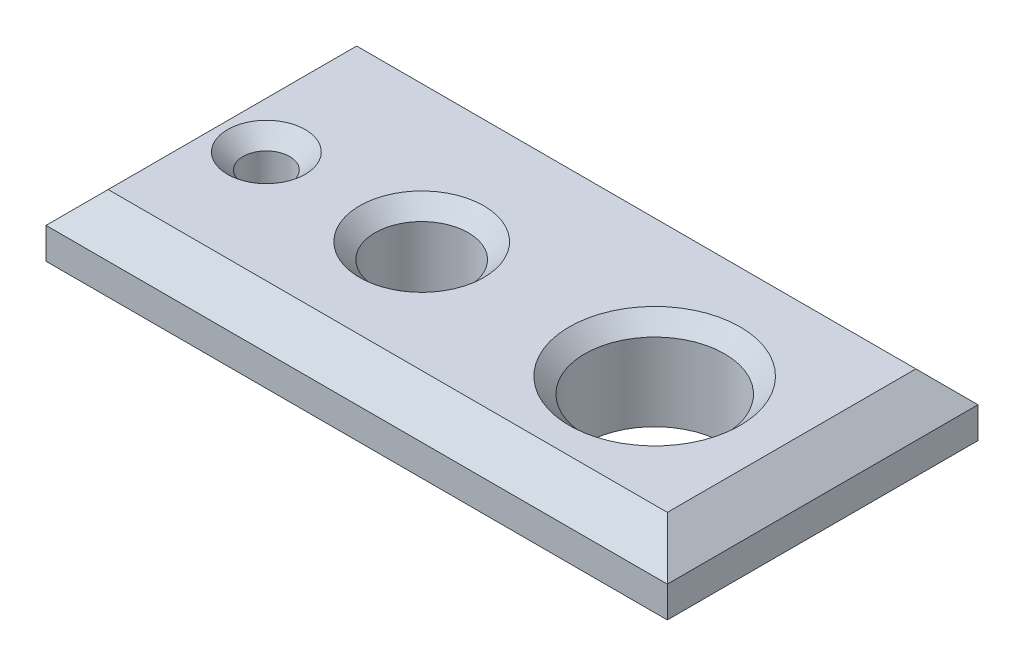
ISO-10303-21;
HEADER;
FILE_DESCRIPTION(('STEP AP214'),'2;1');
FILE_NAME('part.step','',(''),(''),'','','');
FILE_SCHEMA(('AUTOMOTIVE_DESIGN { 1 0 10303 214 1 1 1 1 }'));
ENDSEC;
DATA;
#1=APPLICATION_CONTEXT('core data for automotive mechanical design processes');
#2=APPLICATION_PROTOCOL_DEFINITION('international standard','automotive_design',2000,#1);
#3=PRODUCT_CONTEXT('',#1,'mechanical');
#4=PRODUCT('Part','Part','',(#3));
#5=PRODUCT_RELATED_PRODUCT_CATEGORY('part','',(#4));
#6=PRODUCT_DEFINITION_FORMATION('','',#4);
#7=PRODUCT_DEFINITION_CONTEXT('part definition',#1,'design');
#8=PRODUCT_DEFINITION('design','',#6,#7);
#9=PRODUCT_DEFINITION_SHAPE('','',#8);
#10=(LENGTH_UNIT() NAMED_UNIT(*) SI_UNIT(.MILLI.,.METRE.));
#11=(NAMED_UNIT(*) PLANE_ANGLE_UNIT() SI_UNIT($,.RADIAN.));
#12=(NAMED_UNIT(*) SI_UNIT($,.STERADIAN.) SOLID_ANGLE_UNIT());
#13=UNCERTAINTY_MEASURE_WITH_UNIT(LENGTH_MEASURE(1.E-05),#10,'distance_accuracy_value','');
#14=(GEOMETRIC_REPRESENTATION_CONTEXT(3) GLOBAL_UNCERTAINTY_ASSIGNED_CONTEXT((#13)) GLOBAL_UNIT_ASSIGNED_CONTEXT((#10,
#11,#12)) REPRESENTATION_CONTEXT('',''));
#15=CARTESIAN_POINT('',(0.,0.,0.));
#16=DIRECTION('',(0.,0.,1.));
#17=DIRECTION('',(1.,0.,0.));
#18=AXIS2_PLACEMENT_3D('',#15,#16,#17);
#19=CARTESIAN_POINT('',(0.,30.,0.));
#20=DIRECTION('',(0.,-1.,0.));
#21=DIRECTION('',(0.,0.,-1.));
#22=AXIS2_PLACEMENT_3D('',#19,#20,#21);
#23=PLANE('',#22);
#24=DIRECTION('',(0.,0.,-1.));
#25=VECTOR('',#24,1.);
#26=CARTESIAN_POINT('',(90.,30.,0.));
#27=LINE('',#26,#25);
#28=CARTESIAN_POINT('',(90.,30.,35.9308551425237));
#29=VERTEX_POINT('',#28);
#30=CARTESIAN_POINT('',(90.,30.,-44.0691448574762));
#31=VERTEX_POINT('',#30);
#32=EDGE_CURVE('E134',#29,#31,#27,.T.);
#33=ORIENTED_EDGE('',*,*,#32,.T.);
#34=DIRECTION('',(-1.,0.,0.));
#35=VECTOR('',#34,1.);
#36=CARTESIAN_POINT('',(0.,30.,-44.0691448574762));
#37=LINE('',#36,#35);
#38=CARTESIAN_POINT('',(-90.,30.,-44.0691448574762));
#39=VERTEX_POINT('',#38);
#40=EDGE_CURVE('E113',#31,#39,#37,.T.);
#41=ORIENTED_EDGE('',*,*,#40,.T.);
#42=DIRECTION('',(0.,0.,1.));
#43=VECTOR('',#42,1.);
#44=CARTESIAN_POINT('',(-90.,30.,0.));
#45=LINE('',#44,#43);
#46=CARTESIAN_POINT('',(-90.,30.,35.9308551425237));
#47=VERTEX_POINT('',#46);
#48=EDGE_CURVE('E122',#39,#47,#45,.T.);
#49=ORIENTED_EDGE('',*,*,#48,.T.);
#50=DIRECTION('',(1.,0.,0.));
#51=VECTOR('',#50,1.);
#52=CARTESIAN_POINT('',(0.,30.,35.9308551425237));
#53=LINE('',#52,#51);
#54=EDGE_CURVE('E129',#47,#29,#53,.T.);
#55=ORIENTED_EDGE('',*,*,#54,.T.);
#56=EDGE_LOOP('',(#33,#41,#49,#55));
#57=FACE_BOUND('',#56,.T.);
#58=CARTESIAN_POINT('',(-75.,30.,0.));
#59=DIRECTION('',(0.,-1.,0.));
#60=DIRECTION('',(0.,0.,-1.));
#61=AXIS2_PLACEMENT_3D('',#58,#59,#60);
#62=CIRCLE('',#61,12.5);
#63=CARTESIAN_POINT('',(-75.,30.,12.5));
#64=VERTEX_POINT('',#63);
#65=EDGE_CURVE('E258',#64,#64,#62,.T.);
#66=ORIENTED_EDGE('',*,*,#65,.T.);
#67=EDGE_LOOP('',(#66));
#68=FACE_BOUND('',#67,.T.);
#69=CARTESIAN_POINT('',(50.,30.,0.));
#70=DIRECTION('',(0.,-1.,0.));
#71=DIRECTION('',(0.,0.,-1.));
#72=AXIS2_PLACEMENT_3D('',#69,#70,#71);
#73=CIRCLE('',#72,27.5);
#74=CARTESIAN_POINT('',(50.,30.,-27.5));
#75=VERTEX_POINT('',#74);
#76=EDGE_CURVE('E254',#75,#75,#73,.T.);
#77=ORIENTED_EDGE('',*,*,#76,.T.);
#78=EDGE_LOOP('',(#77));
#79=FACE_BOUND('',#78,.T.);
#80=CARTESIAN_POINT('',(-25.,30.,0.));
#81=DIRECTION('',(0.,-1.,0.));
#82=DIRECTION('',(0.,0.,-1.));
#83=AXIS2_PLACEMENT_3D('',#80,#81,#82);
#84=CIRCLE('',#83,20.);
#85=CARTESIAN_POINT('',(-25.,30.,-20.));
#86=VERTEX_POINT('',#85);
#87=EDGE_CURVE('E250',#86,#86,#84,.T.);
#88=ORIENTED_EDGE('',*,*,#87,.T.);
#89=EDGE_LOOP('',(#88));
#90=FACE_BOUND('',#89,.T.);
#91=ADVANCED_FACE('F41',(#57,#68,#79,#90),#23,.F.);
#92=CARTESIAN_POINT('',(0.,0.,0.));
#93=DIRECTION('',(0.,-1.,0.));
#94=DIRECTION('',(0.,0.,-1.));
#95=AXIS2_PLACEMENT_3D('',#92,#93,#94);
#96=PLANE('',#95);
#97=DIRECTION('',(1.,0.,0.));
#98=VECTOR('',#97,1.);
#99=CARTESIAN_POINT('',(100.,0.,-44.0691448574762));
#100=LINE('',#99,#98);
#101=CARTESIAN_POINT('',(-90.,0.,-44.0691448574762));
#102=VERTEX_POINT('',#101);
#103=CARTESIAN_POINT('',(90.,0.,-44.0691448574762));
#104=VERTEX_POINT('',#103);
#105=EDGE_CURVE('E52',#102,#104,#100,.T.);
#106=ORIENTED_EDGE('',*,*,#105,.T.);
#107=DIRECTION('',(0.,0.,1.));
#108=VECTOR('',#107,1.);
#109=CARTESIAN_POINT('',(90.,0.,45.9308551425237));
#110=LINE('',#109,#108);
#111=CARTESIAN_POINT('',(90.,0.,35.9308551425237));
#112=VERTEX_POINT('',#111);
#113=EDGE_CURVE('E11',#104,#112,#110,.T.);
#114=ORIENTED_EDGE('',*,*,#113,.T.);
#115=DIRECTION('',(-1.,0.,0.));
#116=VECTOR('',#115,1.);
#117=CARTESIAN_POINT('',(-100.,0.,35.9308551425237));
#118=LINE('',#117,#116);
#119=CARTESIAN_POINT('',(-90.,0.,35.9308551425237));
#120=VERTEX_POINT('',#119);
#121=EDGE_CURVE('E166',#112,#120,#118,.T.);
#122=ORIENTED_EDGE('',*,*,#121,.T.);
#123=DIRECTION('',(0.,0.,-1.));
#124=VECTOR('',#123,1.);
#125=CARTESIAN_POINT('',(-90.,0.,-54.0691448574763));
#126=LINE('',#125,#124);
#127=EDGE_CURVE('E63',#120,#102,#126,.T.);
#128=ORIENTED_EDGE('',*,*,#127,.T.);
#129=EDGE_LOOP('',(#106,#114,#122,#128));
#130=FACE_BOUND('',#129,.T.);
#131=CARTESIAN_POINT('',(-25.,0.,0.));
#132=DIRECTION('',(0.,1.,0.));
#133=DIRECTION('',(0.,0.,1.));
#134=AXIS2_PLACEMENT_3D('',#131,#132,#133);
#135=CIRCLE('',#134,15.);
#136=CARTESIAN_POINT('',(-25.,0.,15.));
#137=VERTEX_POINT('',#136);
#138=EDGE_CURVE('E215',#137,#137,#135,.T.);
#139=ORIENTED_EDGE('',*,*,#138,.T.);
#140=EDGE_LOOP('',(#139));
#141=FACE_BOUND('',#140,.T.);
#142=CARTESIAN_POINT('',(-75.,0.,0.));
#143=DIRECTION('',(0.,1.,0.));
#144=DIRECTION('',(0.,0.,1.));
#145=AXIS2_PLACEMENT_3D('',#142,#143,#144);
#146=CIRCLE('',#145,7.50000000000001);
#147=CARTESIAN_POINT('',(-75.,0.,7.50000000000001));
#148=VERTEX_POINT('',#147);
#149=EDGE_CURVE('E219',#148,#148,#146,.T.);
#150=ORIENTED_EDGE('',*,*,#149,.T.);
#151=EDGE_LOOP('',(#150));
#152=FACE_BOUND('',#151,.T.);
#153=CARTESIAN_POINT('',(50.,0.,0.));
#154=DIRECTION('',(0.,1.,0.));
#155=DIRECTION('',(0.,0.,1.));
#156=AXIS2_PLACEMENT_3D('',#153,#154,#155);
#157=CIRCLE('',#156,22.5);
#158=CARTESIAN_POINT('',(50.,0.,22.5));
#159=VERTEX_POINT('',#158);
#160=EDGE_CURVE('E181',#159,#159,#157,.T.);
#161=ORIENTED_EDGE('',*,*,#160,.T.);
#162=EDGE_LOOP('',(#161));
#163=FACE_BOUND('',#162,.T.);
#164=ADVANCED_FACE('F207',(#130,#141,#152,#163),#96,.T.);
#165=CARTESIAN_POINT('',(-100.,30.,45.9308551425237));
#166=DIRECTION('',(1.,0.,0.));
#167=DIRECTION('',(0.,0.,-1.));
#168=AXIS2_PLACEMENT_3D('',#165,#166,#167);
#169=PLANE('',#168);
#170=DIRECTION('',(0.,-1.,0.));
#171=VECTOR('',#170,1.);
#172=CARTESIAN_POINT('',(-100.,30.,45.9308551425237));
#173=LINE('',#172,#171);
#174=CARTESIAN_POINT('',(-100.,19.9999999999999,45.9308551425237));
#175=VERTEX_POINT('',#174);
#176=CARTESIAN_POINT('',(-100.,10.,45.9308551425237));
#177=VERTEX_POINT('',#176);
#178=EDGE_CURVE('E242',#175,#177,#173,.T.);
#179=ORIENTED_EDGE('',*,*,#178,.F.);
#180=DIRECTION('',(0.,0.,-1.));
#181=VECTOR('',#180,1.);
#182=CARTESIAN_POINT('',(-100.,19.9999999999999,45.9308551425237));
#183=LINE('',#182,#181);
#184=CARTESIAN_POINT('',(-100.,19.9999999999999,-54.0691448574763));
#185=VERTEX_POINT('',#184);
#186=EDGE_CURVE('E163',#175,#185,#183,.T.);
#187=ORIENTED_EDGE('',*,*,#186,.T.);
#188=DIRECTION('',(0.,-1.,0.));
#189=VECTOR('',#188,1.);
#190=CARTESIAN_POINT('',(-100.,30.,-54.0691448574763));
#191=LINE('',#190,#189);
#192=CARTESIAN_POINT('',(-100.,10.,-54.0691448574763));
#193=VERTEX_POINT('',#192);
#194=EDGE_CURVE('E230',#185,#193,#191,.T.);
#195=ORIENTED_EDGE('',*,*,#194,.T.);
#196=DIRECTION('',(0.,0.,1.));
#197=VECTOR('',#196,1.);
#198=CARTESIAN_POINT('',(-100.,10.,45.9308551425237));
#199=LINE('',#198,#197);
#200=EDGE_CURVE('E160',#193,#177,#199,.T.);
#201=ORIENTED_EDGE('',*,*,#200,.T.);
#202=EDGE_LOOP('',(#179,#187,#195,#201));
#203=FACE_BOUND('',#202,.T.);
#204=ADVANCED_FACE('F210',(#203),#169,.F.);
#205=CARTESIAN_POINT('',(100.,30.,45.9308551425237));
#206=DIRECTION('',(0.,0.,-1.));
#207=DIRECTION('',(-1.,0.,0.));
#208=AXIS2_PLACEMENT_3D('',#205,#206,#207);
#209=PLANE('',#208);
#210=DIRECTION('',(0.,-1.,0.));
#211=VECTOR('',#210,1.);
#212=CARTESIAN_POINT('',(100.,30.,45.9308551425237));
#213=LINE('',#212,#211);
#214=CARTESIAN_POINT('',(100.,19.9999999999999,45.9308551425237));
#215=VERTEX_POINT('',#214);
#216=CARTESIAN_POINT('',(100.,10.,45.9308551425237));
#217=VERTEX_POINT('',#216);
#218=EDGE_CURVE('E238',#215,#217,#213,.T.);
#219=ORIENTED_EDGE('',*,*,#218,.F.);
#220=DIRECTION('',(-1.,0.,0.));
#221=VECTOR('',#220,1.);
#222=CARTESIAN_POINT('',(100.,19.9999999999999,45.9308551425237));
#223=LINE('',#222,#221);
#224=EDGE_CURVE('E157',#215,#175,#223,.T.);
#225=ORIENTED_EDGE('',*,*,#224,.T.);
#226=ORIENTED_EDGE('',*,*,#178,.T.);
#227=DIRECTION('',(1.,0.,0.));
#228=VECTOR('',#227,1.);
#229=CARTESIAN_POINT('',(100.,10.,45.9308551425237));
#230=LINE('',#229,#228);
#231=EDGE_CURVE('E154',#177,#217,#230,.T.);
#232=ORIENTED_EDGE('',*,*,#231,.T.);
#233=EDGE_LOOP('',(#219,#225,#226,#232));
#234=FACE_BOUND('',#233,.T.);
#235=ADVANCED_FACE('F284',(#234),#209,.F.);
#236=CARTESIAN_POINT('',(100.,30.,-54.0691448574763));
#237=DIRECTION('',(-1.,0.,0.));
#238=DIRECTION('',(0.,0.,1.));
#239=AXIS2_PLACEMENT_3D('',#236,#237,#238);
#240=PLANE('',#239);
#241=DIRECTION('',(0.,-1.,0.));
#242=VECTOR('',#241,1.);
#243=CARTESIAN_POINT('',(100.,30.,-54.0691448574763));
#244=LINE('',#243,#242);
#245=CARTESIAN_POINT('',(100.,19.9999999999999,-54.0691448574763));
#246=VERTEX_POINT('',#245);
#247=CARTESIAN_POINT('',(100.,10.,-54.0691448574763));
#248=VERTEX_POINT('',#247);
#249=EDGE_CURVE('E234',#246,#248,#244,.T.);
#250=ORIENTED_EDGE('',*,*,#249,.F.);
#251=DIRECTION('',(0.,0.,1.));
#252=VECTOR('',#251,1.);
#253=CARTESIAN_POINT('',(100.,19.9999999999999,-54.0691448574763));
#254=LINE('',#253,#252);
#255=EDGE_CURVE('E151',#246,#215,#254,.T.);
#256=ORIENTED_EDGE('',*,*,#255,.T.);
#257=ORIENTED_EDGE('',*,*,#218,.T.);
#258=DIRECTION('',(0.,0.,-1.));
#259=VECTOR('',#258,1.);
#260=CARTESIAN_POINT('',(100.,10.,-54.0691448574763));
#261=LINE('',#260,#259);
#262=EDGE_CURVE('E147',#217,#248,#261,.T.);
#263=ORIENTED_EDGE('',*,*,#262,.T.);
#264=EDGE_LOOP('',(#250,#256,#257,#263));
#265=FACE_BOUND('',#264,.T.);
#266=ADVANCED_FACE('F282',(#265),#240,.F.);
#267=CARTESIAN_POINT('',(-100.,30.,-54.0691448574763));
#268=DIRECTION('',(0.,0.,1.));
#269=DIRECTION('',(1.,0.,0.));
#270=AXIS2_PLACEMENT_3D('',#267,#268,#269);
#271=PLANE('',#270);
#272=ORIENTED_EDGE('',*,*,#194,.F.);
#273=DIRECTION('',(1.,0.,0.));
#274=VECTOR('',#273,1.);
#275=CARTESIAN_POINT('',(-100.,19.9999999999999,-54.0691448574763));
#276=LINE('',#275,#274);
#277=EDGE_CURVE('E115',#185,#246,#276,.T.);
#278=ORIENTED_EDGE('',*,*,#277,.T.);
#279=ORIENTED_EDGE('',*,*,#249,.T.);
#280=DIRECTION('',(-1.,0.,0.));
#281=VECTOR('',#280,1.);
#282=CARTESIAN_POINT('',(-100.,10.,-54.0691448574763));
#283=LINE('',#282,#281);
#284=EDGE_CURVE('E137',#248,#193,#283,.T.);
#285=ORIENTED_EDGE('',*,*,#284,.T.);
#286=EDGE_LOOP('',(#272,#278,#279,#285));
#287=FACE_BOUND('',#286,.T.);
#288=ADVANCED_FACE('F281',(#287),#271,.F.);
#289=CARTESIAN_POINT('',(-75.,30.,0.));
#290=DIRECTION('',(0.,-1.,0.));
#291=DIRECTION('',(0.,0.,-1.));
#292=AXIS2_PLACEMENT_3D('',#289,#290,#291);
#293=CYLINDRICAL_SURFACE('',#292,7.50000000000001);
#294=CARTESIAN_POINT('',(-75.,25.,0.));
#295=DIRECTION('',(0.,-1.,0.));
#296=DIRECTION('',(0.,0.,-1.));
#297=AXIS2_PLACEMENT_3D('',#294,#295,#296);
#298=CIRCLE('',#297,7.50000000000001);
#299=CARTESIAN_POINT('',(-75.,25.,7.50000000000001));
#300=VERTEX_POINT('',#299);
#301=EDGE_CURVE('E246',#300,#300,#298,.F.);
#302=ORIENTED_EDGE('',*,*,#301,.T.);
#303=EDGE_LOOP('',(#302));
#304=FACE_BOUND('',#303,.T.);
#305=ORIENTED_EDGE('',*,*,#149,.F.);
#306=EDGE_LOOP('',(#305));
#307=FACE_BOUND('',#306,.T.);
#308=ADVANCED_FACE('F299',(#304,#307),#293,.F.);
#309=CARTESIAN_POINT('',(-25.,30.,0.));
#310=DIRECTION('',(0.,-1.,0.));
#311=DIRECTION('',(0.,0.,-1.));
#312=AXIS2_PLACEMENT_3D('',#309,#310,#311);
#313=CYLINDRICAL_SURFACE('',#312,15.);
#314=CARTESIAN_POINT('',(-25.,25.,0.));
#315=DIRECTION('',(0.,-1.,0.));
#316=DIRECTION('',(0.,0.,-1.));
#317=AXIS2_PLACEMENT_3D('',#314,#315,#316);
#318=CIRCLE('',#317,15.);
#319=CARTESIAN_POINT('',(-25.,25.,-15.));
#320=VERTEX_POINT('',#319);
#321=EDGE_CURVE('E130',#320,#320,#318,.F.);
#322=ORIENTED_EDGE('',*,*,#321,.T.);
#323=EDGE_LOOP('',(#322));
#324=FACE_BOUND('',#323,.T.);
#325=ORIENTED_EDGE('',*,*,#138,.F.);
#326=EDGE_LOOP('',(#325));
#327=FACE_BOUND('',#326,.T.);
#328=ADVANCED_FACE('F320',(#324,#327),#313,.F.);
#329=CARTESIAN_POINT('',(50.,30.,0.));
#330=DIRECTION('',(0.,-1.,0.));
#331=DIRECTION('',(0.,0.,-1.));
#332=AXIS2_PLACEMENT_3D('',#329,#330,#331);
#333=CYLINDRICAL_SURFACE('',#332,22.5);
#334=CARTESIAN_POINT('',(50.,25.,0.));
#335=DIRECTION('',(0.,-1.,0.));
#336=DIRECTION('',(0.,0.,-1.));
#337=AXIS2_PLACEMENT_3D('',#334,#335,#336);
#338=CIRCLE('',#337,22.5);
#339=CARTESIAN_POINT('',(50.,25.,-22.5));
#340=VERTEX_POINT('',#339);
#341=EDGE_CURVE('E262',#340,#340,#338,.F.);
#342=ORIENTED_EDGE('',*,*,#341,.T.);
#343=EDGE_LOOP('',(#342));
#344=FACE_BOUND('',#343,.T.);
#345=ORIENTED_EDGE('',*,*,#160,.F.);
#346=EDGE_LOOP('',(#345));
#347=FACE_BOUND('',#346,.T.);
#348=ADVANCED_FACE('F327',(#344,#347),#333,.F.);
#349=CARTESIAN_POINT('',(-75.,25.,0.));
#350=DIRECTION('',(0.,1.,0.));
#351=DIRECTION('',(0.,0.,1.));
#352=AXIS2_PLACEMENT_3D('',#349,#350,#351);
#353=CONICAL_SURFACE('',#352,7.50000000000001,0.785398163397448);
#354=CARTESIAN_POINT('',(-75.,30.,12.5));
#355=CARTESIAN_POINT('',(-75.,29.9479166666667,12.4479166666667));
#356=CARTESIAN_POINT('',(-75.,29.8958333333333,12.3958333333334));
#357=CARTESIAN_POINT('',(-75.,29.7916666666667,12.2916666666667));
#358=CARTESIAN_POINT('',(-75.,29.7395833333333,12.2395833333334));
#359=CARTESIAN_POINT('',(-75.,29.6354166666667,12.1354166666667));
#360=CARTESIAN_POINT('',(-75.,29.5833333333333,12.0833333333334));
#361=CARTESIAN_POINT('',(-75.,29.4791666666667,11.9791666666667));
#362=CARTESIAN_POINT('',(-75.,29.4270833333333,11.9270833333334));
#363=CARTESIAN_POINT('',(-75.,29.3229166666667,11.8229166666667));
#364=CARTESIAN_POINT('',(-75.,29.2708333333333,11.7708333333334));
#365=CARTESIAN_POINT('',(-75.,29.1666666666667,11.6666666666667));
#366=CARTESIAN_POINT('',(-75.,29.1145833333333,11.6145833333334));
#367=CARTESIAN_POINT('',(-75.,29.0104166666667,11.5104166666667));
#368=CARTESIAN_POINT('',(-75.,28.9583333333333,11.4583333333334));
#369=CARTESIAN_POINT('',(-75.,28.8541666666667,11.3541666666667));
#370=CARTESIAN_POINT('',(-75.,28.8020833333333,11.3020833333334));
#371=CARTESIAN_POINT('',(-75.,28.6979166666667,11.1979166666667));
#372=CARTESIAN_POINT('',(-75.,28.6458333333333,11.1458333333334));
#373=CARTESIAN_POINT('',(-75.,28.5416666666667,11.0416666666667));
#374=CARTESIAN_POINT('',(-75.,28.4895833333333,10.9895833333334));
#375=CARTESIAN_POINT('',(-75.,28.3854166666667,10.8854166666667));
#376=CARTESIAN_POINT('',(-75.,28.3333333333333,10.8333333333334));
#377=CARTESIAN_POINT('',(-75.,28.2291666666667,10.7291666666667));
#378=CARTESIAN_POINT('',(-75.,28.1770833333333,10.6770833333334));
#379=CARTESIAN_POINT('',(-75.,28.0729166666667,10.5729166666667));
#380=CARTESIAN_POINT('',(-75.,28.0208333333333,10.5208333333334));
#381=CARTESIAN_POINT('',(-75.,27.9166666666667,10.4166666666667));
#382=CARTESIAN_POINT('',(-75.,27.8645833333333,10.3645833333334));
#383=CARTESIAN_POINT('',(-75.,27.7604166666667,10.2604166666667));
#384=CARTESIAN_POINT('',(-75.,27.7083333333333,10.2083333333334));
#385=CARTESIAN_POINT('',(-75.,27.6041666666667,10.1041666666667));
#386=CARTESIAN_POINT('',(-75.,27.5520833333333,10.0520833333334));
#387=CARTESIAN_POINT('',(-75.,27.4479166666667,9.94791666666669));
#388=CARTESIAN_POINT('',(-75.,27.3958333333333,9.89583333333336));
#389=CARTESIAN_POINT('',(-75.,27.2916666666667,9.79166666666669));
#390=CARTESIAN_POINT('',(-75.,27.2395833333333,9.73958333333336));
#391=CARTESIAN_POINT('',(-75.,27.1354166666667,9.63541666666669));
#392=CARTESIAN_POINT('',(-75.,27.0833333333333,9.58333333333336));
#393=CARTESIAN_POINT('',(-75.,26.9791666666667,9.47916666666669));
#394=CARTESIAN_POINT('',(-75.,26.9270833333333,9.42708333333336));
#395=CARTESIAN_POINT('',(-75.,26.8229166666667,9.32291666666669));
#396=CARTESIAN_POINT('',(-75.,26.7708333333333,9.27083333333336));
#397=CARTESIAN_POINT('',(-75.,26.6666666666667,9.16666666666669));
#398=CARTESIAN_POINT('',(-75.,26.6145833333333,9.11458333333336));
#399=CARTESIAN_POINT('',(-75.,26.5104166666666,9.01041666666669));
#400=CARTESIAN_POINT('',(-75.,26.4583333333333,8.95833333333336));
#401=CARTESIAN_POINT('',(-75.,26.3541666666666,8.85416666666669));
#402=CARTESIAN_POINT('',(-75.,26.3020833333333,8.80208333333336));
#403=CARTESIAN_POINT('',(-75.,26.1979166666666,8.69791666666669));
#404=CARTESIAN_POINT('',(-75.,26.1458333333333,8.64583333333336));
#405=CARTESIAN_POINT('',(-75.,26.0416666666666,8.54166666666669));
#406=CARTESIAN_POINT('',(-75.,25.9895833333333,8.48958333333335));
#407=CARTESIAN_POINT('',(-75.,25.8854166666666,8.38541666666669));
#408=CARTESIAN_POINT('',(-75.,25.8333333333333,8.33333333333335));
#409=CARTESIAN_POINT('',(-75.,25.7291666666666,8.22916666666669));
#410=CARTESIAN_POINT('',(-75.,25.6770833333333,8.17708333333335));
#411=CARTESIAN_POINT('',(-75.,25.5729166666666,8.07291666666668));
#412=CARTESIAN_POINT('',(-75.,25.5208333333333,8.02083333333335));
#413=CARTESIAN_POINT('',(-75.,25.4166666666666,7.91666666666668));
#414=CARTESIAN_POINT('',(-75.,25.3645833333333,7.86458333333335));
#415=CARTESIAN_POINT('',(-75.,25.2604166666666,7.76041666666668));
#416=CARTESIAN_POINT('',(-75.,25.2083333333333,7.70833333333335));
#417=CARTESIAN_POINT('',(-75.,25.1041666666666,7.60416666666668));
#418=CARTESIAN_POINT('',(-75.,25.0520833333333,7.55208333333335));
#419=CARTESIAN_POINT('',(-75.,25.,7.50000000000001));
#420=B_SPLINE_CURVE_WITH_KNOTS('',3,(#354,#355,#356,#357,#358,#359,#360,#361,#362,#363,#364,
#365,#366,#367,#368,#369,#370,#371,#372,#373,#374,#375,#376,#377,#378,#379,#380,#381,#382,#383,
#384,#385,#386,#387,#388,#389,#390,#391,#392,#393,#394,#395,#396,#397,#398,#399,#400,#401,#402,
#403,#404,#405,#406,#407,#408,#409,#410,#411,#412,#413,#414,#415,#416,#417,#418,#419),
.UNSPECIFIED.,.F.,.F.,(4,2,2,2,2,2,2,2,2,2,2,2,2,2,2,2,2,2,2,2,2,2,2,2,2,2,2,2,2,2,2,2,4),(0.,
0.220970869120796,0.441941738241596,0.662912607362393,0.88388347648319,1.10485434560399,
1.32582521472478,1.54679608384558,1.76776695296638,1.98873782208718,2.20970869120797,
2.43067956032877,2.65165042944957,2.87262129857036,3.09359216769116,3.31456303681196,
3.53553390593276,3.75650477505356,3.97747564417435,4.19844651329515,4.41941738241595,
4.64038825153674,4.86135912065754,5.08232998977834,5.30330085889914,5.52427172801993,
5.74524259714073,5.96621346626153,6.18718433538233,6.40815520450312,6.62912607362392,
6.85009694274472,7.07106781186552),.UNSPECIFIED.);
#421=EDGE_CURVE('BSEAM334',#64,#300,#420,.T.);
#422=ORIENTED_EDGE('',*,*,#65,.F.);
#423=ORIENTED_EDGE('',*,*,#301,.F.);
#424=ORIENTED_EDGE('',*,*,#421,.T.);
#425=ORIENTED_EDGE('',*,*,#421,.F.);
#426=EDGE_LOOP('',(#422,#424,#423,#425));
#427=FACE_BOUND('',#426,.T.);
#428=ADVANCED_FACE('F334',(#427),#353,.F.);
#429=CARTESIAN_POINT('',(50.,25.,0.));
#430=DIRECTION('',(0.,1.,0.));
#431=DIRECTION('',(0.,0.,1.));
#432=AXIS2_PLACEMENT_3D('',#429,#430,#431);
#433=CONICAL_SURFACE('',#432,22.5,0.785398163397451);
#434=ORIENTED_EDGE('',*,*,#76,.F.);
#435=EDGE_LOOP('',(#434));
#436=FACE_BOUND('',#435,.T.);
#437=ORIENTED_EDGE('',*,*,#341,.F.);
#438=EDGE_LOOP('',(#437));
#439=FACE_BOUND('',#438,.T.);
#440=ADVANCED_FACE('F342',(#436,#439),#433,.F.);
#441=CARTESIAN_POINT('',(-25.,25.,0.));
#442=DIRECTION('',(0.,1.,0.));
#443=DIRECTION('',(0.,0.,1.));
#444=AXIS2_PLACEMENT_3D('',#441,#442,#443);
#445=CONICAL_SURFACE('',#444,15.,0.785398163397451);
#446=ORIENTED_EDGE('',*,*,#87,.F.);
#447=EDGE_LOOP('',(#446));
#448=FACE_BOUND('',#447,.T.);
#449=ORIENTED_EDGE('',*,*,#321,.F.);
#450=EDGE_LOOP('',(#449));
#451=FACE_BOUND('',#450,.T.);
#452=ADVANCED_FACE('F349',(#448,#451),#445,.F.);
#453=CARTESIAN_POINT('',(0.,30.,35.9308551425237));
#454=DIRECTION('',(0.,-0.707106781186545,-0.707106781186549));
#455=DIRECTION('',(1.,0.,0.));
#456=AXIS2_PLACEMENT_3D('',#453,#454,#455);
#457=PLANE('',#456);
#458=DIRECTION('',(0.577350269189625,0.577350269189628,-0.577350269189625));
#459=VECTOR('',#458,1.);
#460=CARTESIAN_POINT('',(-78.0230482858255,41.9769517141746,23.9539034283492));
#461=LINE('',#460,#459);
#462=EDGE_CURVE('E125',#175,#47,#461,.T.);
#463=ORIENTED_EDGE('',*,*,#462,.F.);
#464=ORIENTED_EDGE('',*,*,#224,.F.);
#465=DIRECTION('',(-0.577350269189625,0.577350269189628,-0.577350269189625));
#466=VECTOR('',#465,1.);
#467=CARTESIAN_POINT('',(60.0000000000001,60.0000000000001,5.93085514252385));
#468=LINE('',#467,#466);
#469=EDGE_CURVE('E177',#29,#215,#468,.F.);
#470=ORIENTED_EDGE('',*,*,#469,.F.);
#471=ORIENTED_EDGE('',*,*,#54,.F.);
#472=EDGE_LOOP('',(#463,#464,#470,#471));
#473=FACE_BOUND('',#472,.T.);
#474=ADVANCED_FACE('F272',(#473),#457,.F.);
#475=CARTESIAN_POINT('',(90.,30.,0.));
#476=DIRECTION('',(-0.707106781186549,-0.707106781186545,0.));
#477=DIRECTION('',(0.,0.,-1.));
#478=AXIS2_PLACEMENT_3D('',#475,#476,#477);
#479=PLANE('',#478);
#480=ORIENTED_EDGE('',*,*,#469,.T.);
#481=ORIENTED_EDGE('',*,*,#255,.F.);
#482=DIRECTION('',(-0.577350269189625,0.577350269189628,0.577350269189625));
#483=VECTOR('',#482,1.);
#484=CARTESIAN_POINT('',(75.310285047508,44.6897149524921,-29.3794299049842));
#485=LINE('',#484,#483);
#486=EDGE_CURVE('E119',#31,#246,#485,.F.);
#487=ORIENTED_EDGE('',*,*,#486,.F.);
#488=ORIENTED_EDGE('',*,*,#32,.F.);
#489=EDGE_LOOP('',(#480,#481,#487,#488));
#490=FACE_BOUND('',#489,.T.);
#491=ADVANCED_FACE('F275',(#490),#479,.F.);
#492=CARTESIAN_POINT('',(-90.,30.,0.));
#493=DIRECTION('',(0.707106781186549,-0.707106781186545,0.));
#494=DIRECTION('',(0.,0.,1.));
#495=AXIS2_PLACEMENT_3D('',#492,#493,#494);
#496=PLANE('',#495);
#497=ORIENTED_EDGE('',*,*,#462,.T.);
#498=ORIENTED_EDGE('',*,*,#48,.F.);
#499=DIRECTION('',(-0.577350269189625,-0.577350269189628,-0.577350269189625));
#500=VECTOR('',#499,1.);
#501=CARTESIAN_POINT('',(-75.310285047508,44.6897149524921,-29.3794299049842));
#502=LINE('',#501,#500);
#503=EDGE_CURVE('E109',#185,#39,#502,.F.);
#504=ORIENTED_EDGE('',*,*,#503,.F.);
#505=ORIENTED_EDGE('',*,*,#186,.F.);
#506=EDGE_LOOP('',(#497,#498,#504,#505));
#507=FACE_BOUND('',#506,.T.);
#508=ADVANCED_FACE('F123',(#507),#496,.F.);
#509=CARTESIAN_POINT('',(0.,30.,-44.0691448574762));
#510=DIRECTION('',(0.,-0.707106781186545,0.707106781186549));
#511=DIRECTION('',(-1.,0.,0.));
#512=AXIS2_PLACEMENT_3D('',#509,#510,#511);
#513=PLANE('',#512);
#514=ORIENTED_EDGE('',*,*,#486,.T.);
#515=ORIENTED_EDGE('',*,*,#277,.F.);
#516=ORIENTED_EDGE('',*,*,#503,.T.);
#517=ORIENTED_EDGE('',*,*,#40,.F.);
#518=EDGE_LOOP('',(#514,#515,#516,#517));
#519=FACE_BOUND('',#518,.T.);
#520=ADVANCED_FACE('F111',(#519),#513,.F.);
#521=CARTESIAN_POINT('',(-100.,10.,45.9308551425237));
#522=DIRECTION('',(-0.707106781186547,-0.707106781186549,0.));
#523=DIRECTION('',(0.,0.,-1.));
#524=AXIS2_PLACEMENT_3D('',#521,#522,#523);
#525=PLANE('',#524);
#526=DIRECTION('',(0.577350269189626,-0.577350269189625,0.577350269189626));
#527=VECTOR('',#526,1.);
#528=CARTESIAN_POINT('',(-66.6666666666666,-23.3333333333333,-20.7358115241428));
#529=LINE('',#528,#527);
#530=EDGE_CURVE('E187',#102,#193,#529,.F.);
#531=ORIENTED_EDGE('',*,*,#530,.F.);
#532=ORIENTED_EDGE('',*,*,#127,.F.);
#533=DIRECTION('',(0.577350269189626,-0.577350269189625,-0.577350269189626));
#534=VECTOR('',#533,1.);
#535=CARTESIAN_POINT('',(-33.3333333333332,-56.6666666666666,-20.735811524143));
#536=LINE('',#535,#534);
#537=EDGE_CURVE('E46',#177,#120,#536,.T.);
#538=ORIENTED_EDGE('',*,*,#537,.F.);
#539=ORIENTED_EDGE('',*,*,#200,.F.);
#540=EDGE_LOOP('',(#531,#532,#538,#539));
#541=FACE_BOUND('',#540,.T.);
#542=ADVANCED_FACE('F44',(#541),#525,.T.);
#543=CARTESIAN_POINT('',(100.,10.,45.9308551425237));
#544=DIRECTION('',(0.,-0.707106781186549,0.707106781186547));
#545=DIRECTION('',(-1.,0.,0.));
#546=AXIS2_PLACEMENT_3D('',#543,#544,#545);
#547=PLANE('',#546);
#548=ORIENTED_EDGE('',*,*,#537,.T.);
#549=ORIENTED_EDGE('',*,*,#121,.F.);
#550=DIRECTION('',(0.577350269189626,0.577350269189625,0.577350269189626));
#551=VECTOR('',#550,1.);
#552=CARTESIAN_POINT('',(100.,10.,45.9308551425237));
#553=LINE('',#552,#551);
#554=EDGE_CURVE('E185',#217,#112,#553,.F.);
#555=ORIENTED_EDGE('',*,*,#554,.F.);
#556=ORIENTED_EDGE('',*,*,#231,.F.);
#557=EDGE_LOOP('',(#548,#549,#555,#556));
#558=FACE_BOUND('',#557,.T.);
#559=ADVANCED_FACE('F198',(#558),#547,.T.);
#560=CARTESIAN_POINT('',(-100.,10.,-54.0691448574763));
#561=DIRECTION('',(0.,-0.707106781186549,-0.707106781186547));
#562=DIRECTION('',(1.,0.,0.));
#563=AXIS2_PLACEMENT_3D('',#560,#561,#562);
#564=PLANE('',#563);
#565=ORIENTED_EDGE('',*,*,#530,.T.);
#566=ORIENTED_EDGE('',*,*,#284,.F.);
#567=DIRECTION('',(-0.577350269189626,-0.577350269189625,0.577350269189626));
#568=VECTOR('',#567,1.);
#569=CARTESIAN_POINT('',(33.3333333333332,-56.6666666666666,12.5975218091905));
#570=LINE('',#569,#568);
#571=EDGE_CURVE('E182',#104,#248,#570,.F.);
#572=ORIENTED_EDGE('',*,*,#571,.F.);
#573=ORIENTED_EDGE('',*,*,#105,.F.);
#574=EDGE_LOOP('',(#565,#566,#572,#573));
#575=FACE_BOUND('',#574,.T.);
#576=ADVANCED_FACE('F203',(#575),#564,.T.);
#577=CARTESIAN_POINT('',(100.,10.,-54.0691448574763));
#578=DIRECTION('',(0.707106781186547,-0.707106781186549,0.));
#579=DIRECTION('',(0.,0.,1.));
#580=AXIS2_PLACEMENT_3D('',#577,#578,#579);
#581=PLANE('',#580);
#582=ORIENTED_EDGE('',*,*,#554,.T.);
#583=ORIENTED_EDGE('',*,*,#113,.F.);
#584=ORIENTED_EDGE('',*,*,#571,.T.);
#585=ORIENTED_EDGE('',*,*,#262,.F.);
#586=EDGE_LOOP('',(#582,#583,#584,#585));
#587=FACE_BOUND('',#586,.T.);
#588=ADVANCED_FACE('F206',(#587),#581,.T.);
#589=CLOSED_SHELL('',(#91,#164,#204,#235,#266,#288,#308,#328,#348,#428,#440,#452,#474,#491,#508,
#520,#542,#559,#576,#588));
#590=MANIFOLD_SOLID_BREP('B2',#589);
#591=ADVANCED_BREP_SHAPE_REPRESENTATION('',(#18,#590),#14);
#592=SHAPE_DEFINITION_REPRESENTATION(#9,#591);
ENDSEC;
END-ISO-10303-21;
